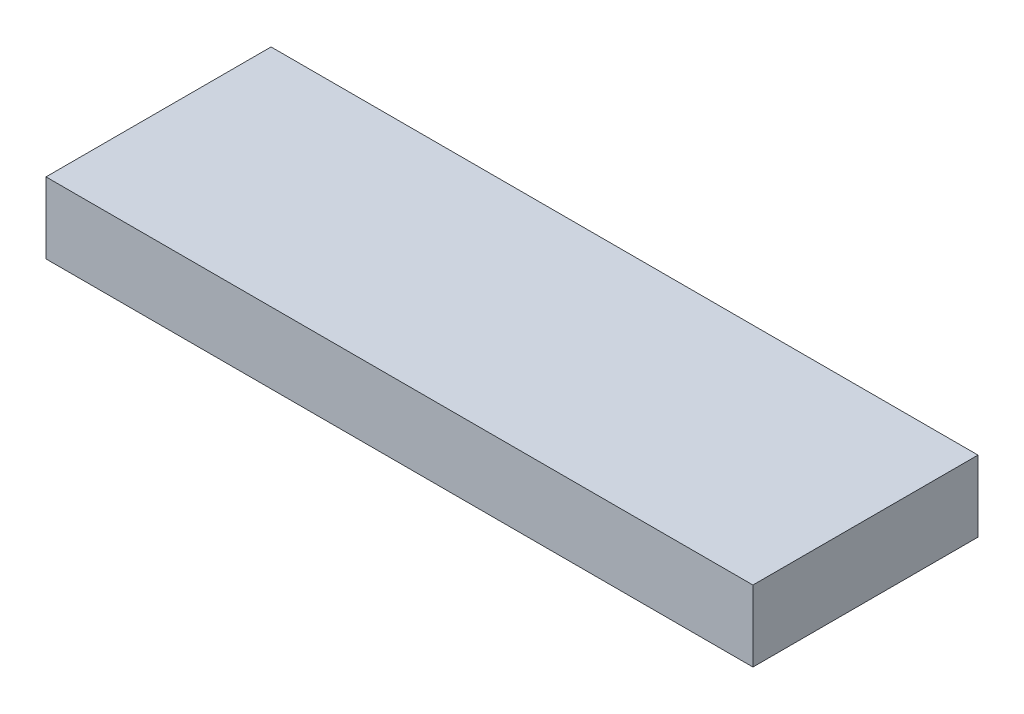
ISO-10303-21;
HEADER;
FILE_DESCRIPTION(('STEP AP214'),'2;1');
FILE_NAME('part.step','',(''),(''),'','','');
FILE_SCHEMA(('AUTOMOTIVE_DESIGN { 1 0 10303 214 1 1 1 1 }'));
ENDSEC;
DATA;
#1=APPLICATION_CONTEXT('core data for automotive mechanical design processes');
#2=APPLICATION_PROTOCOL_DEFINITION('international standard','automotive_design',2000,#1);
#3=PRODUCT_CONTEXT('',#1,'mechanical');
#4=PRODUCT('Part','Part','',(#3));
#5=PRODUCT_RELATED_PRODUCT_CATEGORY('part','',(#4));
#6=PRODUCT_DEFINITION_FORMATION('','',#4);
#7=PRODUCT_DEFINITION_CONTEXT('part definition',#1,'design');
#8=PRODUCT_DEFINITION('design','',#6,#7);
#9=PRODUCT_DEFINITION_SHAPE('','',#8);
#10=(LENGTH_UNIT() NAMED_UNIT(*) SI_UNIT(.MILLI.,.METRE.));
#11=(NAMED_UNIT(*) PLANE_ANGLE_UNIT() SI_UNIT($,.RADIAN.));
#12=(NAMED_UNIT(*) SI_UNIT($,.STERADIAN.) SOLID_ANGLE_UNIT());
#13=UNCERTAINTY_MEASURE_WITH_UNIT(LENGTH_MEASURE(1.E-05),#10,'distance_accuracy_value','');
#14=(GEOMETRIC_REPRESENTATION_CONTEXT(3) GLOBAL_UNCERTAINTY_ASSIGNED_CONTEXT((#13)) GLOBAL_UNIT_ASSIGNED_CONTEXT((#10,
#11,#12)) REPRESENTATION_CONTEXT('',''));
#15=CARTESIAN_POINT('',(0.,0.,0.));
#16=DIRECTION('',(0.,0.,1.));
#17=DIRECTION('',(1.,0.,0.));
#18=AXIS2_PLACEMENT_3D('',#15,#16,#17);
#19=CARTESIAN_POINT('',(0.,0.,0.));
#20=DIRECTION('',(0.,0.,-1.));
#21=DIRECTION('',(-1.,0.,0.));
#22=AXIS2_PLACEMENT_3D('',#19,#20,#21);
#23=PLANE('',#22);
#24=DIRECTION('',(0.,-1.,0.));
#25=VECTOR('',#24,1.);
#26=CARTESIAN_POINT('',(-94.738766336441,-282.575,0.));
#27=LINE('',#26,#25);
#28=CARTESIAN_POINT('',(-94.738766336441,-263.525,0.));
#29=VERTEX_POINT('',#28);
#30=CARTESIAN_POINT('',(-94.738766336441,-282.575,0.));
#31=VERTEX_POINT('',#30);
#32=EDGE_CURVE('E85',#29,#31,#27,.T.);
#33=ORIENTED_EDGE('',*,*,#32,.F.);
#34=DIRECTION('',(-1.,0.,0.));
#35=VECTOR('',#34,1.);
#36=CARTESIAN_POINT('',(-94.738766336441,-263.525,0.));
#37=LINE('',#36,#35);
#38=CARTESIAN_POINT('',(94.738766336441,-263.525,0.));
#39=VERTEX_POINT('',#38);
#40=EDGE_CURVE('E96',#39,#29,#37,.T.);
#41=ORIENTED_EDGE('',*,*,#40,.F.);
#42=DIRECTION('',(0.,1.,0.));
#43=VECTOR('',#42,1.);
#44=CARTESIAN_POINT('',(94.738766336441,-282.575,0.));
#45=LINE('',#44,#43);
#46=CARTESIAN_POINT('',(94.738766336441,-282.575,0.));
#47=VERTEX_POINT('',#46);
#48=EDGE_CURVE('E87',#47,#39,#45,.T.);
#49=ORIENTED_EDGE('',*,*,#48,.F.);
#50=DIRECTION('',(1.,0.,0.));
#51=VECTOR('',#50,1.);
#52=CARTESIAN_POINT('',(-94.738766336441,-282.575,0.));
#53=LINE('',#52,#51);
#54=EDGE_CURVE('E77',#31,#47,#53,.T.);
#55=ORIENTED_EDGE('',*,*,#54,.F.);
#56=EDGE_LOOP('',(#33,#41,#49,#55));
#57=FACE_BOUND('',#56,.T.);
#58=ADVANCED_FACE('F35',(#57),#23,.T.);
#59=CARTESIAN_POINT('',(-94.738766336441,-263.525,250.757764743368));
#60=DIRECTION('',(0.,-1.,0.));
#61=DIRECTION('',(0.,0.,-1.));
#62=AXIS2_PLACEMENT_3D('',#59,#60,#61);
#63=PLANE('',#62);
#64=DIRECTION('',(0.,0.,-1.));
#65=VECTOR('',#64,1.);
#66=CARTESIAN_POINT('',(-94.738766336441,-263.525,250.757764743368));
#67=LINE('',#66,#65);
#68=CARTESIAN_POINT('',(-94.738766336441,-263.525,60.325));
#69=VERTEX_POINT('',#68);
#70=EDGE_CURVE('E90',#69,#29,#67,.T.);
#71=ORIENTED_EDGE('',*,*,#70,.F.);
#72=DIRECTION('',(1.,0.,0.));
#73=VECTOR('',#72,1.);
#74=CARTESIAN_POINT('',(-94.738766336441,-263.525,60.325));
#75=LINE('',#74,#73);
#76=CARTESIAN_POINT('',(94.738766336441,-263.525,60.325));
#77=VERTEX_POINT('',#76);
#78=EDGE_CURVE('E39',#69,#77,#75,.T.);
#79=ORIENTED_EDGE('',*,*,#78,.T.);
#80=DIRECTION('',(0.,0.,-1.));
#81=VECTOR('',#80,1.);
#82=CARTESIAN_POINT('',(94.738766336441,-263.525,250.757764743368));
#83=LINE('',#82,#81);
#84=EDGE_CURVE('E99',#77,#39,#83,.T.);
#85=ORIENTED_EDGE('',*,*,#84,.T.);
#86=ORIENTED_EDGE('',*,*,#40,.T.);
#87=EDGE_LOOP('',(#71,#79,#85,#86));
#88=FACE_BOUND('',#87,.T.);
#89=ADVANCED_FACE('F108',(#88),#63,.F.);
#90=CARTESIAN_POINT('',(94.738766336441,-282.575,250.757764743368));
#91=DIRECTION('',(-1.,0.,0.));
#92=DIRECTION('',(0.,0.,1.));
#93=AXIS2_PLACEMENT_3D('',#90,#91,#92);
#94=PLANE('',#93);
#95=ORIENTED_EDGE('',*,*,#84,.F.);
#96=DIRECTION('',(0.,-1.,0.));
#97=VECTOR('',#96,1.);
#98=CARTESIAN_POINT('',(94.738766336441,-282.575,60.325));
#99=LINE('',#98,#97);
#100=CARTESIAN_POINT('',(94.738766336441,-282.575,60.325));
#101=VERTEX_POINT('',#100);
#102=EDGE_CURVE('E105',#77,#101,#99,.T.);
#103=ORIENTED_EDGE('',*,*,#102,.T.);
#104=DIRECTION('',(0.,0.,-1.));
#105=VECTOR('',#104,1.);
#106=CARTESIAN_POINT('',(94.738766336441,-282.575,250.757764743368));
#107=LINE('',#106,#105);
#108=EDGE_CURVE('E81',#101,#47,#107,.T.);
#109=ORIENTED_EDGE('',*,*,#108,.T.);
#110=ORIENTED_EDGE('',*,*,#48,.T.);
#111=EDGE_LOOP('',(#95,#103,#109,#110));
#112=FACE_BOUND('',#111,.T.);
#113=ADVANCED_FACE('F104',(#112),#94,.F.);
#114=CARTESIAN_POINT('',(-94.738766336441,-282.575,250.757764743368));
#115=DIRECTION('',(0.,1.,0.));
#116=DIRECTION('',(0.,0.,1.));
#117=AXIS2_PLACEMENT_3D('',#114,#115,#116);
#118=PLANE('',#117);
#119=ORIENTED_EDGE('',*,*,#108,.F.);
#120=DIRECTION('',(-1.,0.,0.));
#121=VECTOR('',#120,1.);
#122=CARTESIAN_POINT('',(-94.738766336441,-282.575,60.325));
#123=LINE('',#122,#121);
#124=CARTESIAN_POINT('',(-94.738766336441,-282.575,60.325));
#125=VERTEX_POINT('',#124);
#126=EDGE_CURVE('E44',#101,#125,#123,.T.);
#127=ORIENTED_EDGE('',*,*,#126,.T.);
#128=DIRECTION('',(0.,0.,-1.));
#129=VECTOR('',#128,1.);
#130=CARTESIAN_POINT('',(-94.738766336441,-282.575,250.757764743368));
#131=LINE('',#130,#129);
#132=EDGE_CURVE('E74',#125,#31,#131,.T.);
#133=ORIENTED_EDGE('',*,*,#132,.T.);
#134=ORIENTED_EDGE('',*,*,#54,.T.);
#135=EDGE_LOOP('',(#119,#127,#133,#134));
#136=FACE_BOUND('',#135,.T.);
#137=ADVANCED_FACE('F76',(#136),#118,.F.);
#138=CARTESIAN_POINT('',(-94.738766336441,-282.575,250.757764743368));
#139=DIRECTION('',(1.,0.,0.));
#140=DIRECTION('',(0.,0.,-1.));
#141=AXIS2_PLACEMENT_3D('',#138,#139,#140);
#142=PLANE('',#141);
#143=ORIENTED_EDGE('',*,*,#132,.F.);
#144=DIRECTION('',(0.,1.,0.));
#145=VECTOR('',#144,1.);
#146=CARTESIAN_POINT('',(-94.738766336441,-282.575,60.325));
#147=LINE('',#146,#145);
#148=EDGE_CURVE('E11',#125,#69,#147,.T.);
#149=ORIENTED_EDGE('',*,*,#148,.T.);
#150=ORIENTED_EDGE('',*,*,#70,.T.);
#151=ORIENTED_EDGE('',*,*,#32,.T.);
#152=EDGE_LOOP('',(#143,#149,#150,#151));
#153=FACE_BOUND('',#152,.T.);
#154=ADVANCED_FACE('F37',(#153),#142,.F.);
#155=CARTESIAN_POINT('',(-94.738766336441,-19.0499999999982,60.325));
#156=DIRECTION('',(0.,0.,-1.));
#157=DIRECTION('',(-1.,0.,0.));
#158=AXIS2_PLACEMENT_3D('',#155,#156,#157);
#159=PLANE('',#158);
#160=ORIENTED_EDGE('',*,*,#126,.F.);
#161=ORIENTED_EDGE('',*,*,#102,.F.);
#162=ORIENTED_EDGE('',*,*,#78,.F.);
#163=ORIENTED_EDGE('',*,*,#148,.F.);
#164=EDGE_LOOP('',(#160,#161,#162,#163));
#165=FACE_BOUND('',#164,.T.);
#166=ADVANCED_FACE('F122',(#165),#159,.F.);
#167=CLOSED_SHELL('',(#58,#89,#113,#137,#154,#166));
#168=MANIFOLD_SOLID_BREP('B2',#167);
#169=ADVANCED_BREP_SHAPE_REPRESENTATION('',(#18,#168),#14);
#170=SHAPE_DEFINITION_REPRESENTATION(#9,#169);
ENDSEC;
END-ISO-10303-21;
